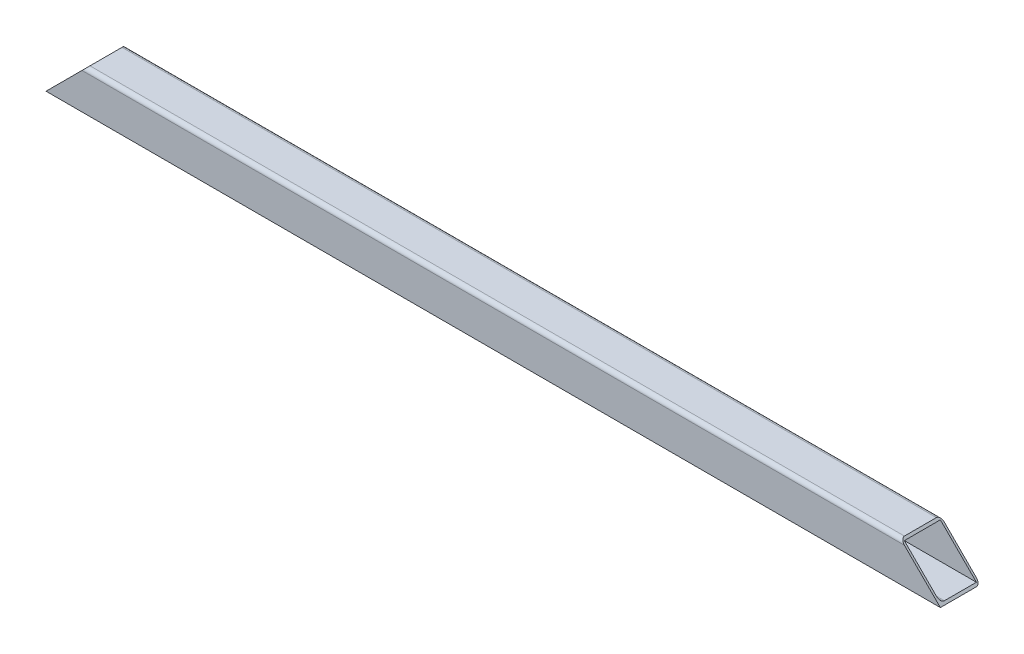
ISO-10303-21;
HEADER;
FILE_DESCRIPTION(('STEP AP214'),'2;1');
FILE_NAME('part.step','',(''),(''),'','','');
FILE_SCHEMA(('AUTOMOTIVE_DESIGN { 1 0 10303 214 1 1 1 1 }'));
ENDSEC;
DATA;
#1=APPLICATION_CONTEXT('core data for automotive mechanical design processes');
#2=APPLICATION_PROTOCOL_DEFINITION('international standard','automotive_design',2000,#1);
#3=PRODUCT_CONTEXT('',#1,'mechanical');
#4=PRODUCT('Part','Part','',(#3));
#5=PRODUCT_RELATED_PRODUCT_CATEGORY('part','',(#4));
#6=PRODUCT_DEFINITION_FORMATION('','',#4);
#7=PRODUCT_DEFINITION_CONTEXT('part definition',#1,'design');
#8=PRODUCT_DEFINITION('design','',#6,#7);
#9=PRODUCT_DEFINITION_SHAPE('','',#8);
#10=(LENGTH_UNIT() NAMED_UNIT(*) SI_UNIT(.MILLI.,.METRE.));
#11=(NAMED_UNIT(*) PLANE_ANGLE_UNIT() SI_UNIT($,.RADIAN.));
#12=(NAMED_UNIT(*) SI_UNIT($,.STERADIAN.) SOLID_ANGLE_UNIT());
#13=UNCERTAINTY_MEASURE_WITH_UNIT(LENGTH_MEASURE(1.E-05),#10,'distance_accuracy_value','');
#14=(GEOMETRIC_REPRESENTATION_CONTEXT(3) GLOBAL_UNCERTAINTY_ASSIGNED_CONTEXT((#13)) GLOBAL_UNIT_ASSIGNED_CONTEXT((#10,
#11,#12)) REPRESENTATION_CONTEXT('',''));
#15=CARTESIAN_POINT('',(0.,0.,0.));
#16=DIRECTION('',(0.,0.,1.));
#17=DIRECTION('',(1.,0.,0.));
#18=AXIS2_PLACEMENT_3D('',#15,#16,#17);
#19=CARTESIAN_POINT('',(-271.504604576393,94.2303771430357,-774.69372114316));
#20=DIRECTION('',(0.,0.,1.));
#21=DIRECTION('',(1.,0.,0.));
#22=AXIS2_PLACEMENT_3D('',#19,#20,#21);
#23=PLANE('',#22);
#24=DIRECTION('',(0.707106781186547,-0.707106781186548,0.));
#25=VECTOR('',#24,1.);
#26=CARTESIAN_POINT('',(5.72770000000011,371.462681719428,-774.69372114316));
#27=LINE('',#26,#25);
#28=CARTESIAN_POINT('',(260.049204576393,117.141177143036,-774.69372114316));
#29=VERTEX_POINT('',#28);
#30=CARTESIAN_POINT('',(282.960004576393,94.2303771430357,-774.69372114316));
#31=VERTEX_POINT('',#30);
#32=EDGE_CURVE('E187',#29,#31,#27,.T.);
#33=ORIENTED_EDGE('',*,*,#32,.F.);
#34=DIRECTION('',(1.,0.,0.));
#35=VECTOR('',#34,1.);
#36=CARTESIAN_POINT('',(-271.504604576393,117.141177143036,-774.69372114316));
#37=LINE('',#36,#35);
#38=CARTESIAN_POINT('',(-260.049204576393,117.141177143036,-774.69372114316));
#39=VERTEX_POINT('',#38);
#40=EDGE_CURVE('E154',#39,#29,#37,.T.);
#41=ORIENTED_EDGE('',*,*,#40,.F.);
#42=DIRECTION('',(0.707106781186547,0.707106781186548,0.));
#43=VECTOR('',#42,1.);
#44=CARTESIAN_POINT('',(-277.232304576393,99.9580771430357,-774.69372114316));
#45=LINE('',#44,#43);
#46=CARTESIAN_POINT('',(-282.960004576393,94.2303771430357,-774.69372114316));
#47=VERTEX_POINT('',#46);
#48=EDGE_CURVE('E136',#47,#39,#45,.T.);
#49=ORIENTED_EDGE('',*,*,#48,.F.);
#50=DIRECTION('',(1.,0.,0.));
#51=VECTOR('',#50,1.);
#52=CARTESIAN_POINT('',(-271.504604576393,94.2303771430357,-774.69372114316));
#53=LINE('',#52,#51);
#54=EDGE_CURVE('E152',#47,#31,#53,.T.);
#55=ORIENTED_EDGE('',*,*,#54,.T.);
#56=EDGE_LOOP('',(#33,#41,#49,#55));
#57=FACE_BOUND('',#56,.T.);
#58=ADVANCED_FACE('F43',(#57),#23,.T.);
#59=CARTESIAN_POINT('',(-271.504604576393,117.141177143036,-751.78292114316));
#60=DIRECTION('',(0.,-1.,0.));
#61=DIRECTION('',(0.,0.,-1.));
#62=AXIS2_PLACEMENT_3D('',#59,#60,#61);
#63=PLANE('',#62);
#64=DIRECTION('',(0.,0.,-1.));
#65=VECTOR('',#64,1.);
#66=CARTESIAN_POINT('',(260.049204576393,117.141177143036,-751.78292114316));
#67=LINE('',#66,#65);
#68=CARTESIAN_POINT('',(260.049204576393,117.141177143036,-751.78292114316));
#69=VERTEX_POINT('',#68);
#70=EDGE_CURVE('E182',#69,#29,#67,.T.);
#71=ORIENTED_EDGE('',*,*,#70,.F.);
#72=DIRECTION('',(1.,0.,0.));
#73=VECTOR('',#72,1.);
#74=CARTESIAN_POINT('',(-271.504604576393,117.141177143036,-751.78292114316));
#75=LINE('',#74,#73);
#76=CARTESIAN_POINT('',(-260.049204576393,117.141177143036,-751.78292114316));
#77=VERTEX_POINT('',#76);
#78=EDGE_CURVE('E164',#77,#69,#75,.T.);
#79=ORIENTED_EDGE('',*,*,#78,.F.);
#80=DIRECTION('',(0.,0.,1.));
#81=VECTOR('',#80,1.);
#82=CARTESIAN_POINT('',(-260.049204576393,117.141177143036,-751.78292114316));
#83=LINE('',#82,#81);
#84=EDGE_CURVE('E157',#39,#77,#83,.T.);
#85=ORIENTED_EDGE('',*,*,#84,.F.);
#86=ORIENTED_EDGE('',*,*,#40,.T.);
#87=EDGE_LOOP('',(#71,#79,#85,#86));
#88=FACE_BOUND('',#87,.T.);
#89=ADVANCED_FACE('F257',(#88),#63,.T.);
#90=CARTESIAN_POINT('',(-271.504604576393,94.2303771430357,-751.78292114316));
#91=DIRECTION('',(0.,0.,-1.));
#92=DIRECTION('',(-1.,0.,0.));
#93=AXIS2_PLACEMENT_3D('',#90,#91,#92);
#94=PLANE('',#93);
#95=DIRECTION('',(-0.707106781186547,0.707106781186548,0.));
#96=VECTOR('',#95,1.);
#97=CARTESIAN_POINT('',(5.72770000000011,371.462681719428,-751.78292114316));
#98=LINE('',#97,#96);
#99=CARTESIAN_POINT('',(280.420004576393,96.7703771430357,-751.78292114316));
#100=VERTEX_POINT('',#99);
#101=EDGE_CURVE('E233',#100,#69,#98,.T.);
#102=ORIENTED_EDGE('',*,*,#101,.F.);
#103=DIRECTION('',(1.,0.,0.));
#104=VECTOR('',#103,1.);
#105=CARTESIAN_POINT('',(-282.960004576393,96.7703771430357,-751.78292114316));
#106=LINE('',#105,#104);
#107=CARTESIAN_POINT('',(-280.420004576393,96.7703771430357,-751.78292114316));
#108=VERTEX_POINT('',#107);
#109=EDGE_CURVE('E186',#100,#108,#106,.F.);
#110=ORIENTED_EDGE('',*,*,#109,.T.);
#111=DIRECTION('',(-0.707106781186547,-0.707106781186548,0.));
#112=VECTOR('',#111,1.);
#113=CARTESIAN_POINT('',(-277.232304576393,99.9580771430357,-751.78292114316));
#114=LINE('',#113,#112);
#115=EDGE_CURVE('E178',#77,#108,#114,.T.);
#116=ORIENTED_EDGE('',*,*,#115,.F.);
#117=ORIENTED_EDGE('',*,*,#78,.T.);
#118=EDGE_LOOP('',(#102,#110,#116,#117));
#119=FACE_BOUND('',#118,.T.);
#120=ADVANCED_FACE('F238',(#119),#94,.T.);
#121=CARTESIAN_POINT('',(-271.504604576393,94.2303771430357,-751.78292114316));
#122=DIRECTION('',(0.,1.,0.));
#123=DIRECTION('',(0.,0.,1.));
#124=AXIS2_PLACEMENT_3D('',#121,#122,#123);
#125=PLANE('',#124);
#126=DIRECTION('',(0.,0.,-1.));
#127=VECTOR('',#126,1.);
#128=CARTESIAN_POINT('',(-282.960004576393,94.2303771430357,-751.78292114316));
#129=LINE('',#128,#127);
#130=CARTESIAN_POINT('',(-282.960004576393,94.2303771430357,-754.32292114316));
#131=VERTEX_POINT('',#130);
#132=EDGE_CURVE('E133',#131,#47,#129,.T.);
#133=ORIENTED_EDGE('',*,*,#132,.F.);
#134=DIRECTION('',(1.,0.,0.));
#135=VECTOR('',#134,1.);
#136=CARTESIAN_POINT('',(282.960004576393,94.2303771430357,-754.32292114316));
#137=LINE('',#136,#135);
#138=CARTESIAN_POINT('',(282.960004576393,94.2303771430357,-754.32292114316));
#139=VERTEX_POINT('',#138);
#140=EDGE_CURVE('E183',#131,#139,#137,.T.);
#141=ORIENTED_EDGE('',*,*,#140,.T.);
#142=DIRECTION('',(0.,0.,1.));
#143=VECTOR('',#142,1.);
#144=CARTESIAN_POINT('',(282.960004576393,94.2303771430357,-751.78292114316));
#145=LINE('',#144,#143);
#146=EDGE_CURVE('E162',#31,#139,#145,.T.);
#147=ORIENTED_EDGE('',*,*,#146,.F.);
#148=ORIENTED_EDGE('',*,*,#54,.F.);
#149=EDGE_LOOP('',(#133,#141,#147,#148));
#150=FACE_BOUND('',#149,.T.);
#151=ADVANCED_FACE('F160',(#150),#125,.T.);
#152=CARTESIAN_POINT('',(-271.504604576393,105.685777143036,-763.238321143161));
#153=DIRECTION('',(0.707106781186548,-0.707106781186547,0.));
#154=DIRECTION('',(0.707106781186547,0.707106781186548,0.));
#155=AXIS2_PLACEMENT_3D('',#152,#153,#154);
#156=PLANE('',#155);
#157=ORIENTED_EDGE('',*,*,#48,.T.);
#158=ORIENTED_EDGE('',*,*,#84,.T.);
#159=ORIENTED_EDGE('',*,*,#115,.T.);
#160=CARTESIAN_POINT('',(-280.420004576393,96.7703771430357,-754.32292114316));
#161=DIRECTION('',(0.707106781186548,-0.707106781186547,0.));
#162=DIRECTION('',(-0.707106781186547,-0.707106781186548,0.));
#163=AXIS2_PLACEMENT_3D('',#160,#161,#162);
#164=ELLIPSE('',#163,3.59210244842766,2.54);
#165=EDGE_CURVE('E11',#108,#131,#164,.T.);
#166=ORIENTED_EDGE('',*,*,#165,.T.);
#167=ORIENTED_EDGE('',*,*,#132,.T.);
#168=EDGE_LOOP('',(#157,#158,#159,#166,#167));
#169=FACE_BOUND('',#168,.T.);
#170=DIRECTION('',(0.707106781186547,0.707106781186548,0.));
#171=VECTOR('',#170,1.);
#172=CARTESIAN_POINT('',(-277.854604576393,99.3357771430357,-775.938321143161));
#173=LINE('',#172,#171);
#174=CARTESIAN_POINT('',(-281.664604576393,95.5257771430358,-775.938321143161));
#175=VERTEX_POINT('',#174);
#176=CARTESIAN_POINT('',(-261.344604576393,115.845777143036,-775.938321143161));
#177=VERTEX_POINT('',#176);
#178=EDGE_CURVE('E146',#175,#177,#173,.T.);
#179=ORIENTED_EDGE('',*,*,#178,.F.);
#180=CARTESIAN_POINT('',(-281.664604576393,95.5257771430357,-773.398321143161));
#181=DIRECTION('',(0.707106781186548,-0.707106781186547,0.));
#182=DIRECTION('',(0.707106781186547,0.707106781186548,0.));
#183=AXIS2_PLACEMENT_3D('',#180,#181,#182);
#184=ELLIPSE('',#183,3.59210244842766,2.54);
#185=CARTESIAN_POINT('',(-284.204604576393,92.9857771430357,-773.398321143161));
#186=VERTEX_POINT('',#185);
#187=EDGE_CURVE('E215',#175,#186,#184,.F.);
#188=ORIENTED_EDGE('',*,*,#187,.T.);
#189=DIRECTION('',(0.,0.,-1.));
#190=VECTOR('',#189,1.);
#191=CARTESIAN_POINT('',(-284.204604576393,92.9857771430357,-750.53832114316));
#192=LINE('',#191,#190);
#193=CARTESIAN_POINT('',(-284.204604576393,92.9857771430357,-750.53832114316));
#194=VERTEX_POINT('',#193);
#195=EDGE_CURVE('E368',#194,#186,#192,.T.);
#196=ORIENTED_EDGE('',*,*,#195,.F.);
#197=DIRECTION('',(-0.707106781186547,-0.707106781186548,0.));
#198=VECTOR('',#197,1.);
#199=CARTESIAN_POINT('',(-277.854604576393,99.3357771430357,-750.53832114316));
#200=LINE('',#199,#198);
#201=CARTESIAN_POINT('',(-261.344604576393,115.845777143036,-750.53832114316));
#202=VERTEX_POINT('',#201);
#203=EDGE_CURVE('E156',#202,#194,#200,.T.);
#204=ORIENTED_EDGE('',*,*,#203,.F.);
#205=CARTESIAN_POINT('',(-261.344604576393,115.845777143036,-753.07832114316));
#206=DIRECTION('',(0.707106781186548,-0.707106781186547,0.));
#207=DIRECTION('',(0.707106781186547,0.707106781186548,0.));
#208=AXIS2_PLACEMENT_3D('',#205,#206,#207);
#209=ELLIPSE('',#208,3.59210244842766,2.54);
#210=CARTESIAN_POINT('',(-258.804604576393,118.385777143036,-753.07832114316));
#211=VERTEX_POINT('',#210);
#212=EDGE_CURVE('E59',#202,#211,#209,.F.);
#213=ORIENTED_EDGE('',*,*,#212,.T.);
#214=DIRECTION('',(0.,0.,1.));
#215=VECTOR('',#214,1.);
#216=CARTESIAN_POINT('',(-258.804604576393,118.385777143036,-750.53832114316));
#217=LINE('',#216,#215);
#218=CARTESIAN_POINT('',(-258.804604576393,118.385777143036,-773.398321143161));
#219=VERTEX_POINT('',#218);
#220=EDGE_CURVE('E175',#219,#211,#217,.T.);
#221=ORIENTED_EDGE('',*,*,#220,.F.);
#222=CARTESIAN_POINT('',(-261.344604576393,115.845777143036,-773.398321143161));
#223=DIRECTION('',(0.707106781186548,-0.707106781186547,0.));
#224=DIRECTION('',(0.707106781186547,0.707106781186548,0.));
#225=AXIS2_PLACEMENT_3D('',#222,#223,#224);
#226=ELLIPSE('',#225,3.59210244842766,2.54);
#227=EDGE_CURVE('E212',#219,#177,#226,.F.);
#228=ORIENTED_EDGE('',*,*,#227,.T.);
#229=EDGE_LOOP('',(#179,#188,#196,#204,#213,#221,#228));
#230=FACE_BOUND('',#229,.T.);
#231=ADVANCED_FACE('F135',(#169,#230),#156,.F.);
#232=CARTESIAN_POINT('',(-271.504604576393,92.9857771430357,-775.938321143161));
#233=DIRECTION('',(0.,0.,1.));
#234=DIRECTION('',(1.,0.,0.));
#235=AXIS2_PLACEMENT_3D('',#232,#233,#234);
#236=PLANE('',#235);
#237=DIRECTION('',(0.707106781186547,-0.707106781186548,0.));
#238=VECTOR('',#237,1.);
#239=CARTESIAN_POINT('',(6.35000000000008,370.840381719428,-775.938321143161));
#240=LINE('',#239,#238);
#241=CARTESIAN_POINT('',(261.344604576393,115.845777143036,-775.938321143161));
#242=VERTEX_POINT('',#241);
#243=CARTESIAN_POINT('',(281.664604576393,95.5257771430357,-775.938321143161));
#244=VERTEX_POINT('',#243);
#245=EDGE_CURVE('E145',#242,#244,#240,.T.);
#246=ORIENTED_EDGE('',*,*,#245,.T.);
#247=DIRECTION('',(1.,0.,0.));
#248=VECTOR('',#247,1.);
#249=CARTESIAN_POINT('',(-271.504604576393,95.5257771430357,-775.938321143161));
#250=LINE('',#249,#248);
#251=EDGE_CURVE('E207',#244,#175,#250,.F.);
#252=ORIENTED_EDGE('',*,*,#251,.T.);
#253=ORIENTED_EDGE('',*,*,#178,.T.);
#254=DIRECTION('',(1.,0.,0.));
#255=VECTOR('',#254,1.);
#256=CARTESIAN_POINT('',(-271.504604576393,115.845777143036,-775.938321143161));
#257=LINE('',#256,#255);
#258=EDGE_CURVE('E203',#177,#242,#257,.T.);
#259=ORIENTED_EDGE('',*,*,#258,.T.);
#260=EDGE_LOOP('',(#246,#252,#253,#259));
#261=FACE_BOUND('',#260,.T.);
#262=ADVANCED_FACE('F268',(#261),#236,.F.);
#263=CARTESIAN_POINT('',(-271.504604576393,92.9857771430357,-750.53832114316));
#264=DIRECTION('',(0.,1.,0.));
#265=DIRECTION('',(0.,0.,1.));
#266=AXIS2_PLACEMENT_3D('',#263,#264,#265);
#267=PLANE('',#266);
#268=ORIENTED_EDGE('',*,*,#195,.T.);
#269=DIRECTION('',(1.,0.,0.));
#270=VECTOR('',#269,1.);
#271=CARTESIAN_POINT('',(-271.504604576393,92.9857771430357,-773.398321143161));
#272=LINE('',#271,#270);
#273=CARTESIAN_POINT('',(284.204604576393,92.9857771430357,-773.398321143161));
#274=VERTEX_POINT('',#273);
#275=EDGE_CURVE('E190',#186,#274,#272,.T.);
#276=ORIENTED_EDGE('',*,*,#275,.T.);
#277=DIRECTION('',(0.,0.,1.));
#278=VECTOR('',#277,1.);
#279=CARTESIAN_POINT('',(284.204604576393,92.9857771430357,-750.53832114316));
#280=LINE('',#279,#278);
#281=CARTESIAN_POINT('',(284.204604576393,92.9857771430357,-750.53832114316));
#282=VERTEX_POINT('',#281);
#283=EDGE_CURVE('E358',#274,#282,#280,.T.);
#284=ORIENTED_EDGE('',*,*,#283,.T.);
#285=DIRECTION('',(1.,0.,0.));
#286=VECTOR('',#285,1.);
#287=CARTESIAN_POINT('',(-271.504604576393,92.9857771430357,-750.53832114316));
#288=LINE('',#287,#286);
#289=EDGE_CURVE('E171',#194,#282,#288,.T.);
#290=ORIENTED_EDGE('',*,*,#289,.F.);
#291=EDGE_LOOP('',(#268,#276,#284,#290));
#292=FACE_BOUND('',#291,.T.);
#293=ADVANCED_FACE('F271',(#292),#267,.F.);
#294=CARTESIAN_POINT('',(-271.504604576393,92.9857771430357,-750.53832114316));
#295=DIRECTION('',(0.,0.,-1.));
#296=DIRECTION('',(-1.,0.,0.));
#297=AXIS2_PLACEMENT_3D('',#294,#295,#296);
#298=PLANE('',#297);
#299=DIRECTION('',(-0.707106781186547,0.707106781186548,0.));
#300=VECTOR('',#299,1.);
#301=CARTESIAN_POINT('',(6.35000000000008,370.840381719428,-750.53832114316));
#302=LINE('',#301,#300);
#303=CARTESIAN_POINT('',(261.344604576393,115.845777143036,-750.53832114316));
#304=VERTEX_POINT('',#303);
#305=EDGE_CURVE('E352',#282,#304,#302,.T.);
#306=ORIENTED_EDGE('',*,*,#305,.T.);
#307=DIRECTION('',(1.,0.,0.));
#308=VECTOR('',#307,1.);
#309=CARTESIAN_POINT('',(-271.504604576393,115.845777143036,-750.53832114316));
#310=LINE('',#309,#308);
#311=EDGE_CURVE('E224',#304,#202,#310,.F.);
#312=ORIENTED_EDGE('',*,*,#311,.T.);
#313=ORIENTED_EDGE('',*,*,#203,.T.);
#314=ORIENTED_EDGE('',*,*,#289,.T.);
#315=EDGE_LOOP('',(#306,#312,#313,#314));
#316=FACE_BOUND('',#315,.T.);
#317=ADVANCED_FACE('F275',(#316),#298,.F.);
#318=CARTESIAN_POINT('',(-271.504604576393,118.385777143036,-750.53832114316));
#319=DIRECTION('',(0.,-1.,0.));
#320=DIRECTION('',(0.,0.,-1.));
#321=AXIS2_PLACEMENT_3D('',#318,#319,#320);
#322=PLANE('',#321);
#323=DIRECTION('',(0.,0.,-1.));
#324=VECTOR('',#323,1.);
#325=CARTESIAN_POINT('',(258.804604576393,118.385777143036,-750.53832114316));
#326=LINE('',#325,#324);
#327=CARTESIAN_POINT('',(258.804604576393,118.385777143036,-753.07832114316));
#328=VERTEX_POINT('',#327);
#329=CARTESIAN_POINT('',(258.804604576393,118.385777143036,-773.398321143161));
#330=VERTEX_POINT('',#329);
#331=EDGE_CURVE('E346',#328,#330,#326,.T.);
#332=ORIENTED_EDGE('',*,*,#331,.T.);
#333=DIRECTION('',(1.,0.,0.));
#334=VECTOR('',#333,1.);
#335=CARTESIAN_POINT('',(-271.504604576393,118.385777143036,-773.398321143161));
#336=LINE('',#335,#334);
#337=EDGE_CURVE('E66',#330,#219,#336,.F.);
#338=ORIENTED_EDGE('',*,*,#337,.T.);
#339=ORIENTED_EDGE('',*,*,#220,.T.);
#340=DIRECTION('',(1.,0.,0.));
#341=VECTOR('',#340,1.);
#342=CARTESIAN_POINT('',(-271.504604576393,118.385777143036,-753.07832114316));
#343=LINE('',#342,#341);
#344=EDGE_CURVE('E218',#211,#328,#343,.T.);
#345=ORIENTED_EDGE('',*,*,#344,.T.);
#346=EDGE_LOOP('',(#332,#338,#339,#345));
#347=FACE_BOUND('',#346,.T.);
#348=ADVANCED_FACE('F253',(#347),#322,.F.);
#349=CARTESIAN_POINT('',(271.504604576393,105.685777143036,-763.238321143161));
#350=DIRECTION('',(-0.707106781186548,-0.707106781186547,0.));
#351=DIRECTION('',(0.707106781186547,-0.707106781186548,0.));
#352=AXIS2_PLACEMENT_3D('',#349,#350,#351);
#353=PLANE('',#352);
#354=ORIENTED_EDGE('',*,*,#146,.T.);
#355=CARTESIAN_POINT('',(280.420004576393,96.7703771430357,-754.32292114316));
#356=DIRECTION('',(-0.707106781186548,-0.707106781186547,0.));
#357=DIRECTION('',(-0.707106781186547,0.707106781186548,0.));
#358=AXIS2_PLACEMENT_3D('',#355,#356,#357);
#359=ELLIPSE('',#358,3.59210244842766,2.54);
#360=EDGE_CURVE('E52',#139,#100,#359,.T.);
#361=ORIENTED_EDGE('',*,*,#360,.T.);
#362=ORIENTED_EDGE('',*,*,#101,.T.);
#363=ORIENTED_EDGE('',*,*,#70,.T.);
#364=ORIENTED_EDGE('',*,*,#32,.T.);
#365=EDGE_LOOP('',(#354,#361,#362,#363,#364));
#366=FACE_BOUND('',#365,.T.);
#367=ORIENTED_EDGE('',*,*,#283,.F.);
#368=CARTESIAN_POINT('',(281.664604576393,95.5257771430357,-773.398321143161));
#369=DIRECTION('',(-0.707106781186548,-0.707106781186547,0.));
#370=DIRECTION('',(0.707106781186547,-0.707106781186548,0.));
#371=AXIS2_PLACEMENT_3D('',#368,#369,#370);
#372=ELLIPSE('',#371,3.59210244842766,2.54);
#373=EDGE_CURVE('E200',#274,#244,#372,.F.);
#374=ORIENTED_EDGE('',*,*,#373,.T.);
#375=ORIENTED_EDGE('',*,*,#245,.F.);
#376=CARTESIAN_POINT('',(261.344604576393,115.845777143036,-773.398321143161));
#377=DIRECTION('',(-0.707106781186548,-0.707106781186547,0.));
#378=DIRECTION('',(0.707106781186547,-0.707106781186548,0.));
#379=AXIS2_PLACEMENT_3D('',#376,#377,#378);
#380=ELLIPSE('',#379,3.59210244842766,2.54);
#381=EDGE_CURVE('E197',#242,#330,#380,.F.);
#382=ORIENTED_EDGE('',*,*,#381,.T.);
#383=ORIENTED_EDGE('',*,*,#331,.F.);
#384=CARTESIAN_POINT('',(261.344604576393,115.845777143036,-753.07832114316));
#385=DIRECTION('',(-0.707106781186548,-0.707106781186547,0.));
#386=DIRECTION('',(0.707106781186547,-0.707106781186548,0.));
#387=AXIS2_PLACEMENT_3D('',#384,#385,#386);
#388=ELLIPSE('',#387,3.59210244842766,2.54);
#389=EDGE_CURVE('E194',#328,#304,#388,.F.);
#390=ORIENTED_EDGE('',*,*,#389,.T.);
#391=ORIENTED_EDGE('',*,*,#305,.F.);
#392=EDGE_LOOP('',(#367,#374,#375,#382,#383,#390,#391));
#393=FACE_BOUND('',#392,.T.);
#394=ADVANCED_FACE('F231',(#366,#393),#353,.F.);
#395=CARTESIAN_POINT('',(-271.504604576393,96.7703771430357,-754.32292114316));
#396=DIRECTION('',(-1.,0.,0.));
#397=DIRECTION('',(0.,0.,1.));
#398=AXIS2_PLACEMENT_3D('',#395,#396,#397);
#399=CYLINDRICAL_SURFACE('',#398,2.54);
#400=ORIENTED_EDGE('',*,*,#165,.F.);
#401=ORIENTED_EDGE('',*,*,#109,.F.);
#402=ORIENTED_EDGE('',*,*,#360,.F.);
#403=ORIENTED_EDGE('',*,*,#140,.F.);
#404=EDGE_LOOP('',(#400,#401,#402,#403));
#405=FACE_BOUND('',#404,.T.);
#406=ADVANCED_FACE('F242',(#405),#399,.F.);
#407=CARTESIAN_POINT('',(-271.504604576393,95.5257771430357,-773.398321143161));
#408=DIRECTION('',(1.,0.,0.));
#409=DIRECTION('',(0.,0.,-1.));
#410=AXIS2_PLACEMENT_3D('',#407,#408,#409);
#411=CYLINDRICAL_SURFACE('',#410,2.54);
#412=ORIENTED_EDGE('',*,*,#187,.F.);
#413=ORIENTED_EDGE('',*,*,#251,.F.);
#414=ORIENTED_EDGE('',*,*,#373,.F.);
#415=ORIENTED_EDGE('',*,*,#275,.F.);
#416=EDGE_LOOP('',(#412,#413,#414,#415));
#417=FACE_BOUND('',#416,.T.);
#418=ADVANCED_FACE('F244',(#417),#411,.T.);
#419=CARTESIAN_POINT('',(-271.504604576393,115.845777143036,-773.398321143161));
#420=DIRECTION('',(1.,0.,0.));
#421=DIRECTION('',(0.,0.,-1.));
#422=AXIS2_PLACEMENT_3D('',#419,#420,#421);
#423=CYLINDRICAL_SURFACE('',#422,2.54);
#424=ORIENTED_EDGE('',*,*,#227,.F.);
#425=ORIENTED_EDGE('',*,*,#337,.F.);
#426=ORIENTED_EDGE('',*,*,#381,.F.);
#427=ORIENTED_EDGE('',*,*,#258,.F.);
#428=EDGE_LOOP('',(#424,#425,#426,#427));
#429=FACE_BOUND('',#428,.T.);
#430=ADVANCED_FACE('F250',(#429),#423,.T.);
#431=CARTESIAN_POINT('',(-271.504604576393,115.845777143036,-753.07832114316));
#432=DIRECTION('',(1.,0.,0.));
#433=DIRECTION('',(0.,0.,-1.));
#434=AXIS2_PLACEMENT_3D('',#431,#432,#433);
#435=CYLINDRICAL_SURFACE('',#434,2.54);
#436=ORIENTED_EDGE('',*,*,#212,.F.);
#437=ORIENTED_EDGE('',*,*,#311,.F.);
#438=ORIENTED_EDGE('',*,*,#389,.F.);
#439=ORIENTED_EDGE('',*,*,#344,.F.);
#440=EDGE_LOOP('',(#436,#437,#438,#439));
#441=FACE_BOUND('',#440,.T.);
#442=ADVANCED_FACE('F45',(#441),#435,.T.);
#443=CLOSED_SHELL('',(#58,#89,#120,#151,#231,#262,#293,#317,#348,#394,#406,#418,#430,#442));
#444=MANIFOLD_SOLID_BREP('B2',#443);
#445=ADVANCED_BREP_SHAPE_REPRESENTATION('',(#18,#444),#14);
#446=SHAPE_DEFINITION_REPRESENTATION(#9,#445);
ENDSEC;
END-ISO-10303-21;
